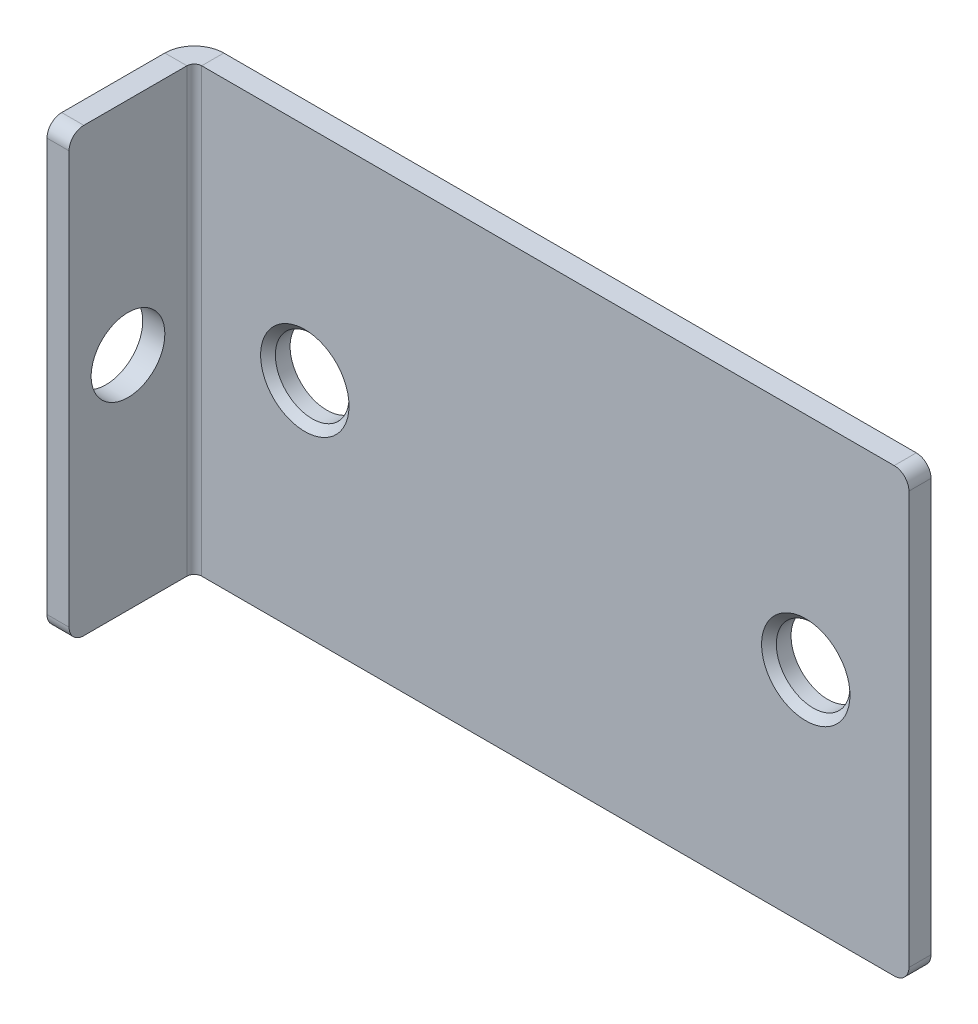
ISO-10303-21;
HEADER;
FILE_DESCRIPTION(('STEP AP214'),'2;1');
FILE_NAME('part.step','',(''),(''),'','','');
FILE_SCHEMA(('AUTOMOTIVE_DESIGN { 1 0 10303 214 1 1 1 1 }'));
ENDSEC;
DATA;
#1=APPLICATION_CONTEXT('core data for automotive mechanical design processes');
#2=APPLICATION_PROTOCOL_DEFINITION('international standard','automotive_design',2000,#1);
#3=PRODUCT_CONTEXT('',#1,'mechanical');
#4=PRODUCT('Part','Part','',(#3));
#5=PRODUCT_RELATED_PRODUCT_CATEGORY('part','',(#4));
#6=PRODUCT_DEFINITION_FORMATION('','',#4);
#7=PRODUCT_DEFINITION_CONTEXT('part definition',#1,'design');
#8=PRODUCT_DEFINITION('design','',#6,#7);
#9=PRODUCT_DEFINITION_SHAPE('','',#8);
#10=(LENGTH_UNIT() NAMED_UNIT(*) SI_UNIT(.MILLI.,.METRE.));
#11=(NAMED_UNIT(*) PLANE_ANGLE_UNIT() SI_UNIT($,.RADIAN.));
#12=(NAMED_UNIT(*) SI_UNIT($,.STERADIAN.) SOLID_ANGLE_UNIT());
#13=UNCERTAINTY_MEASURE_WITH_UNIT(LENGTH_MEASURE(1.E-05),#10,'distance_accuracy_value','');
#14=(GEOMETRIC_REPRESENTATION_CONTEXT(3) GLOBAL_UNCERTAINTY_ASSIGNED_CONTEXT((#13)) GLOBAL_UNIT_ASSIGNED_CONTEXT((#10,
#11,#12)) REPRESENTATION_CONTEXT('',''));
#15=CARTESIAN_POINT('',(0.,0.,0.));
#16=DIRECTION('',(0.,0.,1.));
#17=DIRECTION('',(1.,0.,0.));
#18=AXIS2_PLACEMENT_3D('',#15,#16,#17);
#19=CARTESIAN_POINT('',(0.,0.593023255813957,-0.15));
#20=DIRECTION('',(0.,-1.,0.));
#21=DIRECTION('',(1.,0.,0.));
#22=AXIS2_PLACEMENT_3D('',#19,#20,#21);
#23=PLANE('',#22);
#24=DIRECTION('',(1.,0.,0.));
#25=VECTOR('',#24,1.);
#26=CARTESIAN_POINT('',(0.,0.593023255813957,-0.15));
#27=LINE('',#26,#25);
#28=CARTESIAN_POINT('',(0.199999999999999,0.593023255813957,-0.15));
#29=VERTEX_POINT('',#28);
#30=CARTESIAN_POINT('',(4.9,0.59302325581396,-0.15));
#31=VERTEX_POINT('',#30);
#32=EDGE_CURVE('E227',#29,#31,#27,.T.);
#33=ORIENTED_EDGE('',*,*,#32,.T.);
#34=DIRECTION('',(0.,0.,1.));
#35=VECTOR('',#34,1.);
#36=CARTESIAN_POINT('',(4.9,0.59302325581396,-0.15));
#37=LINE('',#36,#35);
#38=CARTESIAN_POINT('',(4.9,0.59302325581396,0.));
#39=VERTEX_POINT('',#38);
#40=EDGE_CURVE('E13',#31,#39,#37,.T.);
#41=ORIENTED_EDGE('',*,*,#40,.T.);
#42=DIRECTION('',(1.,0.,0.));
#43=VECTOR('',#42,1.);
#44=CARTESIAN_POINT('',(0.,0.593023255813957,0.));
#45=LINE('',#44,#43);
#46=CARTESIAN_POINT('',(0.199999999999999,0.593023255813957,0.));
#47=VERTEX_POINT('',#46);
#48=EDGE_CURVE('E224',#47,#39,#45,.T.);
#49=ORIENTED_EDGE('',*,*,#48,.F.);
#50=DIRECTION('',(0.,0.,-1.));
#51=VECTOR('',#50,1.);
#52=CARTESIAN_POINT('',(0.2,0.593023255813957,0.));
#53=LINE('',#52,#51);
#54=EDGE_CURVE('E213',#47,#29,#53,.T.);
#55=ORIENTED_EDGE('',*,*,#54,.T.);
#56=EDGE_LOOP('',(#33,#41,#49,#55));
#57=FACE_BOUND('',#56,.T.);
#58=ADVANCED_FACE('F65',(#57),#23,.T.);
#59=CARTESIAN_POINT('',(0.,0.,-0.15));
#60=DIRECTION('',(0.,0.,1.));
#61=DIRECTION('',(1.,0.,0.));
#62=AXIS2_PLACEMENT_3D('',#59,#60,#61);
#63=PLANE('',#62);
#64=CARTESIAN_POINT('',(0.899999999999998,2.09302325581396,-0.15));
#65=DIRECTION('',(0.,0.,1.));
#66=DIRECTION('',(1.,0.,0.));
#67=AXIS2_PLACEMENT_3D('',#64,#65,#66);
#68=CIRCLE('',#67,0.25);
#69=CARTESIAN_POINT('',(1.15,2.09302325581396,-0.15));
#70=VERTEX_POINT('',#69);
#71=EDGE_CURVE('E372',#70,#70,#68,.T.);
#72=ORIENTED_EDGE('',*,*,#71,.T.);
#73=EDGE_LOOP('',(#72));
#74=FACE_BOUND('',#73,.T.);
#75=CARTESIAN_POINT('',(4.3,2.09302325581396,-0.15));
#76=DIRECTION('',(0.,0.,1.));
#77=DIRECTION('',(1.,0.,0.));
#78=AXIS2_PLACEMENT_3D('',#75,#76,#77);
#79=CIRCLE('',#78,0.25);
#80=CARTESIAN_POINT('',(4.55,2.09302325581396,-0.15));
#81=VERTEX_POINT('',#80);
#82=EDGE_CURVE('E388',#81,#81,#79,.T.);
#83=ORIENTED_EDGE('',*,*,#82,.T.);
#84=EDGE_LOOP('',(#83));
#85=FACE_BOUND('',#84,.T.);
#86=DIRECTION('',(-1.,0.,0.));
#87=VECTOR('',#86,1.);
#88=CARTESIAN_POINT('',(0.,3.59302325581396,-0.15));
#89=LINE('',#88,#87);
#90=CARTESIAN_POINT('',(4.9,3.59302325581396,-0.15));
#91=VERTEX_POINT('',#90);
#92=CARTESIAN_POINT('',(0.199999999999998,3.59302325581396,-0.15));
#93=VERTEX_POINT('',#92);
#94=EDGE_CURVE('E233',#91,#93,#89,.T.);
#95=ORIENTED_EDGE('',*,*,#94,.F.);
#96=CARTESIAN_POINT('',(4.9,3.49302325581396,-0.15));
#97=DIRECTION('',(0.,0.,1.));
#98=DIRECTION('',(1.,0.,0.));
#99=AXIS2_PLACEMENT_3D('',#96,#97,#98);
#100=CIRCLE('',#99,0.1);
#101=CARTESIAN_POINT('',(5.,3.49302325581396,-0.15));
#102=VERTEX_POINT('',#101);
#103=EDGE_CURVE('E73',#91,#102,#100,.F.);
#104=ORIENTED_EDGE('',*,*,#103,.T.);
#105=DIRECTION('',(0.,1.,0.));
#106=VECTOR('',#105,1.);
#107=CARTESIAN_POINT('',(5.,3.59302325581396,-0.15));
#108=LINE('',#107,#106);
#109=CARTESIAN_POINT('',(5.,0.69302325581396,-0.15));
#110=VERTEX_POINT('',#109);
#111=EDGE_CURVE('E229',#110,#102,#108,.T.);
#112=ORIENTED_EDGE('',*,*,#111,.F.);
#113=CARTESIAN_POINT('',(4.9,0.693023255813961,-0.15));
#114=DIRECTION('',(0.,0.,1.));
#115=DIRECTION('',(1.,0.,0.));
#116=AXIS2_PLACEMENT_3D('',#113,#114,#115);
#117=CIRCLE('',#116,0.1);
#118=EDGE_CURVE('E80',#110,#31,#117,.F.);
#119=ORIENTED_EDGE('',*,*,#118,.T.);
#120=ORIENTED_EDGE('',*,*,#32,.F.);
#121=DIRECTION('',(0.,-1.,0.));
#122=VECTOR('',#121,1.);
#123=CARTESIAN_POINT('',(0.199999999999999,0.593023255813957,-0.15));
#124=LINE('',#123,#122);
#125=EDGE_CURVE('E165',#29,#93,#124,.F.);
#126=ORIENTED_EDGE('',*,*,#125,.T.);
#127=EDGE_LOOP('',(#95,#104,#112,#119,#120,#126));
#128=FACE_BOUND('',#127,.T.);
#129=ADVANCED_FACE('F269',(#74,#85,#128),#63,.F.);
#130=CARTESIAN_POINT('',(0.,0.,0.));
#131=DIRECTION('',(0.,0.,1.));
#132=DIRECTION('',(1.,0.,0.));
#133=AXIS2_PLACEMENT_3D('',#130,#131,#132);
#134=PLANE('',#133);
#135=CARTESIAN_POINT('',(0.899999999999998,2.09302325581396,0.));
#136=DIRECTION('',(0.,0.,1.));
#137=DIRECTION('',(1.,0.,0.));
#138=AXIS2_PLACEMENT_3D('',#135,#136,#137);
#139=CIRCLE('',#138,0.3);
#140=CARTESIAN_POINT('',(1.2,2.09302325581396,0.));
#141=VERTEX_POINT('',#140);
#142=EDGE_CURVE('E376',#141,#141,#139,.T.);
#143=ORIENTED_EDGE('',*,*,#142,.F.);
#144=EDGE_LOOP('',(#143));
#145=FACE_BOUND('',#144,.T.);
#146=CARTESIAN_POINT('',(4.3,2.09302325581396,0.));
#147=DIRECTION('',(0.,0.,1.));
#148=DIRECTION('',(1.,0.,0.));
#149=AXIS2_PLACEMENT_3D('',#146,#147,#148);
#150=CIRCLE('',#149,0.3);
#151=CARTESIAN_POINT('',(4.6,2.09302325581396,0.));
#152=VERTEX_POINT('',#151);
#153=EDGE_CURVE('E378',#152,#152,#150,.T.);
#154=ORIENTED_EDGE('',*,*,#153,.F.);
#155=EDGE_LOOP('',(#154));
#156=FACE_BOUND('',#155,.T.);
#157=DIRECTION('',(0.,1.,0.));
#158=VECTOR('',#157,1.);
#159=CARTESIAN_POINT('',(5.,3.59302325581396,0.));
#160=LINE('',#159,#158);
#161=CARTESIAN_POINT('',(5.,0.69302325581396,0.));
#162=VERTEX_POINT('',#161);
#163=CARTESIAN_POINT('',(5.,3.49302325581396,0.));
#164=VERTEX_POINT('',#163);
#165=EDGE_CURVE('E238',#162,#164,#160,.T.);
#166=ORIENTED_EDGE('',*,*,#165,.T.);
#167=CARTESIAN_POINT('',(4.9,3.49302325581396,0.));
#168=DIRECTION('',(0.,0.,1.));
#169=DIRECTION('',(1.,0.,0.));
#170=AXIS2_PLACEMENT_3D('',#167,#168,#169);
#171=CIRCLE('',#170,0.1);
#172=CARTESIAN_POINT('',(4.9,3.59302325581396,0.));
#173=VERTEX_POINT('',#172);
#174=EDGE_CURVE('E265',#164,#173,#171,.T.);
#175=ORIENTED_EDGE('',*,*,#174,.T.);
#176=DIRECTION('',(-1.,0.,0.));
#177=VECTOR('',#176,1.);
#178=CARTESIAN_POINT('',(0.,3.59302325581396,0.));
#179=LINE('',#178,#177);
#180=CARTESIAN_POINT('',(0.199999999999998,3.59302325581396,0.));
#181=VERTEX_POINT('',#180);
#182=EDGE_CURVE('E230',#173,#181,#179,.T.);
#183=ORIENTED_EDGE('',*,*,#182,.T.);
#184=DIRECTION('',(0.,-1.,0.));
#185=VECTOR('',#184,1.);
#186=CARTESIAN_POINT('',(0.2,0.593023255813957,0.));
#187=LINE('',#186,#185);
#188=EDGE_CURVE('E217',#47,#181,#187,.F.);
#189=ORIENTED_EDGE('',*,*,#188,.F.);
#190=ORIENTED_EDGE('',*,*,#48,.T.);
#191=CARTESIAN_POINT('',(4.9,0.693023255813961,0.));
#192=DIRECTION('',(0.,0.,1.));
#193=DIRECTION('',(1.,0.,0.));
#194=AXIS2_PLACEMENT_3D('',#191,#192,#193);
#195=CIRCLE('',#194,0.1);
#196=EDGE_CURVE('E263',#39,#162,#195,.T.);
#197=ORIENTED_EDGE('',*,*,#196,.T.);
#198=EDGE_LOOP('',(#166,#175,#183,#189,#190,#197));
#199=FACE_BOUND('',#198,.T.);
#200=ADVANCED_FACE('F278',(#145,#156,#199),#134,.T.);
#201=CARTESIAN_POINT('',(0.,3.59302325581396,-0.15));
#202=DIRECTION('',(0.,1.,0.));
#203=DIRECTION('',(-1.,0.,0.));
#204=AXIS2_PLACEMENT_3D('',#201,#202,#203);
#205=PLANE('',#204);
#206=ORIENTED_EDGE('',*,*,#182,.F.);
#207=DIRECTION('',(0.,0.,1.));
#208=VECTOR('',#207,1.);
#209=CARTESIAN_POINT('',(4.9,3.59302325581396,-0.15));
#210=LINE('',#209,#208);
#211=EDGE_CURVE('E88',#173,#91,#210,.F.);
#212=ORIENTED_EDGE('',*,*,#211,.T.);
#213=ORIENTED_EDGE('',*,*,#94,.T.);
#214=DIRECTION('',(0.,0.,-1.));
#215=VECTOR('',#214,1.);
#216=CARTESIAN_POINT('',(0.199999999999998,3.59302325581396,0.));
#217=LINE('',#216,#215);
#218=EDGE_CURVE('E221',#181,#93,#217,.T.);
#219=ORIENTED_EDGE('',*,*,#218,.F.);
#220=EDGE_LOOP('',(#206,#212,#213,#219));
#221=FACE_BOUND('',#220,.T.);
#222=ADVANCED_FACE('F280',(#221),#205,.T.);
#223=CARTESIAN_POINT('',(5.,3.59302325581396,-0.15));
#224=DIRECTION('',(1.,0.,0.));
#225=DIRECTION('',(0.,1.,0.));
#226=AXIS2_PLACEMENT_3D('',#223,#224,#225);
#227=PLANE('',#226);
#228=ORIENTED_EDGE('',*,*,#111,.T.);
#229=DIRECTION('',(0.,0.,1.));
#230=VECTOR('',#229,1.);
#231=CARTESIAN_POINT('',(5.,3.49302325581396,-0.15));
#232=LINE('',#231,#230);
#233=EDGE_CURVE('E260',#102,#164,#232,.T.);
#234=ORIENTED_EDGE('',*,*,#233,.T.);
#235=ORIENTED_EDGE('',*,*,#165,.F.);
#236=DIRECTION('',(0.,0.,1.));
#237=VECTOR('',#236,1.);
#238=CARTESIAN_POINT('',(5.,0.69302325581396,-0.15));
#239=LINE('',#238,#237);
#240=EDGE_CURVE('E258',#162,#110,#239,.F.);
#241=ORIENTED_EDGE('',*,*,#240,.T.);
#242=EDGE_LOOP('',(#228,#234,#235,#241));
#243=FACE_BOUND('',#242,.T.);
#244=ADVANCED_FACE('F273',(#243),#227,.T.);
#245=CARTESIAN_POINT('',(0.199999999999998,3.59302325581396,0.05));
#246=DIRECTION('',(0.,1.,0.));
#247=DIRECTION('',(-1.,0.,0.));
#248=AXIS2_PLACEMENT_3D('',#245,#246,#247);
#249=PLANE('',#248);
#250=DIRECTION('',(1.,0.,0.));
#251=VECTOR('',#250,1.);
#252=CARTESIAN_POINT('',(0.,3.59302325581396,0.0499999999999993));
#253=LINE('',#252,#251);
#254=CARTESIAN_POINT('',(0.149999999999999,3.59302325581396,0.0499999999999998));
#255=VERTEX_POINT('',#254);
#256=CARTESIAN_POINT('',(0.,3.59302325581396,0.0499999999999993));
#257=VERTEX_POINT('',#256);
#258=EDGE_CURVE('E207',#255,#257,#253,.F.);
#259=ORIENTED_EDGE('',*,*,#258,.F.);
#260=CARTESIAN_POINT('',(0.199999999999998,3.59302325581396,0.05));
#261=DIRECTION('',(0.,-1.,0.));
#262=DIRECTION('',(1.,0.,0.));
#263=AXIS2_PLACEMENT_3D('',#260,#261,#262);
#264=CIRCLE('',#263,0.0499999999999996);
#265=EDGE_CURVE('E168',#181,#255,#264,.F.);
#266=ORIENTED_EDGE('',*,*,#265,.F.);
#267=ORIENTED_EDGE('',*,*,#218,.T.);
#268=CARTESIAN_POINT('',(0.199999999999998,3.59302325581396,0.05));
#269=DIRECTION('',(0.,-1.,0.));
#270=DIRECTION('',(1.,0.,0.));
#271=AXIS2_PLACEMENT_3D('',#268,#269,#270);
#272=CIRCLE('',#271,0.2);
#273=EDGE_CURVE('E212',#93,#257,#272,.F.);
#274=ORIENTED_EDGE('',*,*,#273,.T.);
#275=EDGE_LOOP('',(#259,#266,#267,#274));
#276=FACE_BOUND('',#275,.T.);
#277=ADVANCED_FACE('F288',(#276),#249,.T.);
#278=CARTESIAN_POINT('',(0.2,0.593023255813957,0.05));
#279=DIRECTION('',(0.,1.,0.));
#280=DIRECTION('',(-1.,0.,0.));
#281=AXIS2_PLACEMENT_3D('',#278,#279,#280);
#282=PLANE('',#281);
#283=CARTESIAN_POINT('',(0.2,0.593023255813957,0.05));
#284=DIRECTION('',(0.,-1.,0.));
#285=DIRECTION('',(1.,0.,0.));
#286=AXIS2_PLACEMENT_3D('',#283,#284,#285);
#287=CIRCLE('',#286,0.0499999999999996);
#288=CARTESIAN_POINT('',(0.15,0.593023255813957,0.0499999999999998));
#289=VERTEX_POINT('',#288);
#290=EDGE_CURVE('E175',#289,#47,#287,.T.);
#291=ORIENTED_EDGE('',*,*,#290,.F.);
#292=DIRECTION('',(1.,0.,0.));
#293=VECTOR('',#292,1.);
#294=CARTESIAN_POINT('',(0.15,0.593023255813957,0.0499999999999998));
#295=LINE('',#294,#293);
#296=CARTESIAN_POINT('',(0.,0.593023255813957,0.0499999999999993));
#297=VERTEX_POINT('',#296);
#298=EDGE_CURVE('E172',#289,#297,#295,.F.);
#299=ORIENTED_EDGE('',*,*,#298,.T.);
#300=CARTESIAN_POINT('',(0.2,0.593023255813957,0.05));
#301=DIRECTION('',(0.,-1.,0.));
#302=DIRECTION('',(1.,0.,0.));
#303=AXIS2_PLACEMENT_3D('',#300,#301,#302);
#304=CIRCLE('',#303,0.2);
#305=EDGE_CURVE('E157',#297,#29,#304,.T.);
#306=ORIENTED_EDGE('',*,*,#305,.T.);
#307=ORIENTED_EDGE('',*,*,#54,.F.);
#308=EDGE_LOOP('',(#291,#299,#306,#307));
#309=FACE_BOUND('',#308,.T.);
#310=ADVANCED_FACE('F173',(#309),#282,.F.);
#311=CARTESIAN_POINT('',(0.2,0.593023255813957,0.05));
#312=DIRECTION('',(0.,-1.,0.));
#313=DIRECTION('',(-1.,0.,0.));
#314=AXIS2_PLACEMENT_3D('',#311,#312,#313);
#315=CYLINDRICAL_SURFACE('',#314,0.2);
#316=ORIENTED_EDGE('',*,*,#125,.F.);
#317=ORIENTED_EDGE('',*,*,#305,.F.);
#318=DIRECTION('',(0.,-1.,0.));
#319=VECTOR('',#318,1.);
#320=CARTESIAN_POINT('',(0.,3.59302325581396,0.0499999999999993));
#321=LINE('',#320,#319);
#322=EDGE_CURVE('E162',#297,#257,#321,.F.);
#323=ORIENTED_EDGE('',*,*,#322,.T.);
#324=ORIENTED_EDGE('',*,*,#273,.F.);
#325=EDGE_LOOP('',(#316,#317,#323,#324));
#326=FACE_BOUND('',#325,.T.);
#327=ADVANCED_FACE('F159',(#326),#315,.T.);
#328=CARTESIAN_POINT('',(0.2,0.593023255813957,0.05));
#329=DIRECTION('',(0.,-1.,0.));
#330=DIRECTION('',(-1.,0.,0.));
#331=AXIS2_PLACEMENT_3D('',#328,#329,#330);
#332=CYLINDRICAL_SURFACE('',#331,0.0499999999999996);
#333=ORIENTED_EDGE('',*,*,#188,.T.);
#334=ORIENTED_EDGE('',*,*,#265,.T.);
#335=DIRECTION('',(0.,-1.,0.));
#336=VECTOR('',#335,1.);
#337=CARTESIAN_POINT('',(0.149999999999999,3.59302325581396,0.0499999999999998));
#338=LINE('',#337,#336);
#339=EDGE_CURVE('E180',#255,#289,#338,.T.);
#340=ORIENTED_EDGE('',*,*,#339,.T.);
#341=ORIENTED_EDGE('',*,*,#290,.T.);
#342=EDGE_LOOP('',(#333,#334,#340,#341));
#343=FACE_BOUND('',#342,.T.);
#344=ADVANCED_FACE('F284',(#343),#332,.F.);
#345=CARTESIAN_POINT('',(0.,0.593023255813957,0.85));
#346=DIRECTION('',(0.,1.,0.));
#347=DIRECTION('',(-1.,0.,0.));
#348=AXIS2_PLACEMENT_3D('',#345,#346,#347);
#349=PLANE('',#348);
#350=DIRECTION('',(0.,0.,-1.));
#351=VECTOR('',#350,1.);
#352=CARTESIAN_POINT('',(0.149999999999997,0.593023255813957,0.850000000000001));
#353=LINE('',#352,#351);
#354=CARTESIAN_POINT('',(0.149999999999997,0.593023255813957,0.750000000000001));
#355=VERTEX_POINT('',#354);
#356=EDGE_CURVE('E190',#289,#355,#353,.F.);
#357=ORIENTED_EDGE('',*,*,#356,.T.);
#358=DIRECTION('',(1.,0.,0.));
#359=VECTOR('',#358,1.);
#360=CARTESIAN_POINT('',(0.,0.593023255813957,0.75));
#361=LINE('',#360,#359);
#362=CARTESIAN_POINT('',(0.,0.593023255813957,0.75));
#363=VERTEX_POINT('',#362);
#364=EDGE_CURVE('E194',#355,#363,#361,.F.);
#365=ORIENTED_EDGE('',*,*,#364,.T.);
#366=DIRECTION('',(0.,0.,1.));
#367=VECTOR('',#366,1.);
#368=CARTESIAN_POINT('',(0.,0.593023255813957,0.));
#369=LINE('',#368,#367);
#370=EDGE_CURVE('E186',#297,#363,#369,.T.);
#371=ORIENTED_EDGE('',*,*,#370,.F.);
#372=ORIENTED_EDGE('',*,*,#298,.F.);
#373=EDGE_LOOP('',(#357,#365,#371,#372));
#374=FACE_BOUND('',#373,.T.);
#375=ADVANCED_FACE('F192',(#374),#349,.F.);
#376=CARTESIAN_POINT('',(0.,3.59302325581396,0.));
#377=DIRECTION('',(0.,-1.,0.));
#378=DIRECTION('',(1.,0.,0.));
#379=AXIS2_PLACEMENT_3D('',#376,#377,#378);
#380=PLANE('',#379);
#381=DIRECTION('',(0.,0.,-1.));
#382=VECTOR('',#381,1.);
#383=CARTESIAN_POINT('',(0.,3.59302325581396,0.));
#384=LINE('',#383,#382);
#385=CARTESIAN_POINT('',(0.,3.59302325581396,0.75));
#386=VERTEX_POINT('',#385);
#387=EDGE_CURVE('E189',#386,#257,#384,.T.);
#388=ORIENTED_EDGE('',*,*,#387,.F.);
#389=DIRECTION('',(1.,0.,0.));
#390=VECTOR('',#389,1.);
#391=CARTESIAN_POINT('',(0.,3.59302325581396,0.75));
#392=LINE('',#391,#390);
#393=CARTESIAN_POINT('',(0.149999999999996,3.59302325581396,0.750000000000001));
#394=VERTEX_POINT('',#393);
#395=EDGE_CURVE('E235',#386,#394,#392,.T.);
#396=ORIENTED_EDGE('',*,*,#395,.T.);
#397=DIRECTION('',(0.,0.,1.));
#398=VECTOR('',#397,1.);
#399=CARTESIAN_POINT('',(0.149999999999999,3.59302325581396,0.));
#400=LINE('',#399,#398);
#401=EDGE_CURVE('E196',#394,#255,#400,.F.);
#402=ORIENTED_EDGE('',*,*,#401,.T.);
#403=ORIENTED_EDGE('',*,*,#258,.T.);
#404=EDGE_LOOP('',(#388,#396,#402,#403));
#405=FACE_BOUND('',#404,.T.);
#406=ADVANCED_FACE('F290',(#405),#380,.F.);
#407=CARTESIAN_POINT('',(0.,0.,0.));
#408=DIRECTION('',(1.,0.,0.));
#409=DIRECTION('',(0.,0.,-1.));
#410=AXIS2_PLACEMENT_3D('',#407,#408,#409);
#411=PLANE('',#410);
#412=CARTESIAN_POINT('',(0.,2.09302325581396,0.45));
#413=DIRECTION('',(1.,0.,0.));
#414=DIRECTION('',(0.,0.,-1.));
#415=AXIS2_PLACEMENT_3D('',#412,#413,#414);
#416=CIRCLE('',#415,0.25);
#417=CARTESIAN_POINT('',(0.,2.09302325581396,0.2));
#418=VERTEX_POINT('',#417);
#419=EDGE_CURVE('E210',#418,#418,#416,.T.);
#420=ORIENTED_EDGE('',*,*,#419,.T.);
#421=EDGE_LOOP('',(#420));
#422=FACE_BOUND('',#421,.T.);
#423=DIRECTION('',(0.,1.,0.));
#424=VECTOR('',#423,1.);
#425=CARTESIAN_POINT('',(0.,0.,0.85));
#426=LINE('',#425,#424);
#427=CARTESIAN_POINT('',(0.,0.693023255813957,0.85));
#428=VERTEX_POINT('',#427);
#429=CARTESIAN_POINT('',(0.,3.49302325581396,0.85));
#430=VERTEX_POINT('',#429);
#431=EDGE_CURVE('E195',#428,#430,#426,.T.);
#432=ORIENTED_EDGE('',*,*,#431,.T.);
#433=CARTESIAN_POINT('',(0.,3.49302325581396,0.75));
#434=DIRECTION('',(1.,0.,0.));
#435=DIRECTION('',(0.,0.,-1.));
#436=AXIS2_PLACEMENT_3D('',#433,#434,#435);
#437=CIRCLE('',#436,0.1);
#438=EDGE_CURVE('E255',#430,#386,#437,.F.);
#439=ORIENTED_EDGE('',*,*,#438,.T.);
#440=ORIENTED_EDGE('',*,*,#387,.T.);
#441=ORIENTED_EDGE('',*,*,#322,.F.);
#442=ORIENTED_EDGE('',*,*,#370,.T.);
#443=CARTESIAN_POINT('',(0.,0.693023255813957,0.75));
#444=DIRECTION('',(1.,0.,0.));
#445=DIRECTION('',(0.,0.,-1.));
#446=AXIS2_PLACEMENT_3D('',#443,#444,#445);
#447=CIRCLE('',#446,0.1);
#448=EDGE_CURVE('E253',#363,#428,#447,.F.);
#449=ORIENTED_EDGE('',*,*,#448,.T.);
#450=EDGE_LOOP('',(#432,#439,#440,#441,#442,#449));
#451=FACE_BOUND('',#450,.T.);
#452=ADVANCED_FACE('F185',(#422,#451),#411,.F.);
#453=CARTESIAN_POINT('',(0.15,0.,0.));
#454=DIRECTION('',(1.,0.,0.));
#455=DIRECTION('',(0.,0.,-1.));
#456=AXIS2_PLACEMENT_3D('',#453,#454,#455);
#457=PLANE('',#456);
#458=CARTESIAN_POINT('',(0.149999999999998,2.09302325581396,0.45));
#459=DIRECTION('',(1.,0.,0.));
#460=DIRECTION('',(0.,0.,-1.));
#461=AXIS2_PLACEMENT_3D('',#458,#459,#460);
#462=CIRCLE('',#461,0.25);
#463=CARTESIAN_POINT('',(0.149999999999999,2.09302325581396,0.2));
#464=VERTEX_POINT('',#463);
#465=EDGE_CURVE('E391',#464,#464,#462,.T.);
#466=ORIENTED_EDGE('',*,*,#465,.F.);
#467=EDGE_LOOP('',(#466));
#468=FACE_BOUND('',#467,.T.);
#469=ORIENTED_EDGE('',*,*,#401,.F.);
#470=CARTESIAN_POINT('',(0.149999999999996,3.49302325581396,0.750000000000001));
#471=DIRECTION('',(1.,0.,0.));
#472=DIRECTION('',(0.,0.,-1.));
#473=AXIS2_PLACEMENT_3D('',#470,#471,#472);
#474=CIRCLE('',#473,0.1);
#475=CARTESIAN_POINT('',(0.149999999999996,3.49302325581396,0.850000000000001));
#476=VERTEX_POINT('',#475);
#477=EDGE_CURVE('E246',#394,#476,#474,.T.);
#478=ORIENTED_EDGE('',*,*,#477,.T.);
#479=DIRECTION('',(0.,-1.,0.));
#480=VECTOR('',#479,1.);
#481=CARTESIAN_POINT('',(0.149999999999996,3.59302325581396,0.850000000000001));
#482=LINE('',#481,#480);
#483=CARTESIAN_POINT('',(0.149999999999997,0.693023255813957,0.850000000000001));
#484=VERTEX_POINT('',#483);
#485=EDGE_CURVE('E199',#484,#476,#482,.F.);
#486=ORIENTED_EDGE('',*,*,#485,.F.);
#487=CARTESIAN_POINT('',(0.149999999999997,0.693023255813957,0.750000000000001));
#488=DIRECTION('',(1.,0.,0.));
#489=DIRECTION('',(0.,0.,-1.));
#490=AXIS2_PLACEMENT_3D('',#487,#488,#489);
#491=CIRCLE('',#490,0.1);
#492=EDGE_CURVE('E244',#484,#355,#491,.T.);
#493=ORIENTED_EDGE('',*,*,#492,.T.);
#494=ORIENTED_EDGE('',*,*,#356,.F.);
#495=ORIENTED_EDGE('',*,*,#339,.F.);
#496=EDGE_LOOP('',(#469,#478,#486,#493,#494,#495));
#497=FACE_BOUND('',#496,.T.);
#498=ADVANCED_FACE('F294',(#468,#497),#457,.T.);
#499=CARTESIAN_POINT('',(0.,3.59302325581396,0.85));
#500=DIRECTION('',(0.,0.,-1.));
#501=DIRECTION('',(-1.,0.,0.));
#502=AXIS2_PLACEMENT_3D('',#499,#500,#501);
#503=PLANE('',#502);
#504=ORIENTED_EDGE('',*,*,#485,.T.);
#505=DIRECTION('',(1.,0.,0.));
#506=VECTOR('',#505,1.);
#507=CARTESIAN_POINT('',(0.,3.49302325581396,0.85));
#508=LINE('',#507,#506);
#509=EDGE_CURVE('E251',#476,#430,#508,.F.);
#510=ORIENTED_EDGE('',*,*,#509,.T.);
#511=ORIENTED_EDGE('',*,*,#431,.F.);
#512=DIRECTION('',(1.,0.,0.));
#513=VECTOR('',#512,1.);
#514=CARTESIAN_POINT('',(0.,0.693023255813957,0.85));
#515=LINE('',#514,#513);
#516=EDGE_CURVE('E248',#428,#484,#515,.T.);
#517=ORIENTED_EDGE('',*,*,#516,.T.);
#518=EDGE_LOOP('',(#504,#510,#511,#517));
#519=FACE_BOUND('',#518,.T.);
#520=ADVANCED_FACE('F302',(#519),#503,.F.);
#521=CARTESIAN_POINT('',(0.,2.09302325581396,0.45));
#522=DIRECTION('',(1.,0.,0.));
#523=DIRECTION('',(0.,0.,-1.));
#524=AXIS2_PLACEMENT_3D('',#521,#522,#523);
#525=CYLINDRICAL_SURFACE('',#524,0.25);
#526=ORIENTED_EDGE('',*,*,#419,.F.);
#527=EDGE_LOOP('',(#526));
#528=FACE_BOUND('',#527,.T.);
#529=ORIENTED_EDGE('',*,*,#465,.T.);
#530=EDGE_LOOP('',(#529));
#531=FACE_BOUND('',#530,.T.);
#532=ADVANCED_FACE('F345',(#528,#531),#525,.F.);
#533=CARTESIAN_POINT('',(4.3,2.09302325581396,0.));
#534=DIRECTION('',(0.,0.,1.));
#535=DIRECTION('',(1.,0.,0.));
#536=AXIS2_PLACEMENT_3D('',#533,#534,#535);
#537=CYLINDRICAL_SURFACE('',#536,0.25);
#538=ORIENTED_EDGE('',*,*,#82,.F.);
#539=EDGE_LOOP('',(#538));
#540=FACE_BOUND('',#539,.T.);
#541=CARTESIAN_POINT('',(4.3,2.09302325581396,-0.0499999999999999));
#542=DIRECTION('',(0.,0.,1.));
#543=DIRECTION('',(1.,0.,0.));
#544=AXIS2_PLACEMENT_3D('',#541,#542,#543);
#545=CIRCLE('',#544,0.25);
#546=CARTESIAN_POINT('',(4.55,2.09302325581396,-0.0499999999999999));
#547=VERTEX_POINT('',#546);
#548=EDGE_CURVE('E385',#547,#547,#545,.T.);
#549=ORIENTED_EDGE('',*,*,#548,.T.);
#550=EDGE_LOOP('',(#549));
#551=FACE_BOUND('',#550,.T.);
#552=ADVANCED_FACE('F356',(#540,#551),#537,.F.);
#553=CARTESIAN_POINT('',(4.3,2.09302325581396,0.));
#554=DIRECTION('',(0.,0.,1.));
#555=DIRECTION('',(1.,0.,0.));
#556=AXIS2_PLACEMENT_3D('',#553,#554,#555);
#557=CONICAL_SURFACE('',#556,0.3,0.785398163397429);
#558=ORIENTED_EDGE('',*,*,#548,.F.);
#559=EDGE_LOOP('',(#558));
#560=FACE_BOUND('',#559,.T.);
#561=ORIENTED_EDGE('',*,*,#153,.T.);
#562=EDGE_LOOP('',(#561));
#563=FACE_BOUND('',#562,.T.);
#564=ADVANCED_FACE('F360',(#560,#563),#557,.F.);
#565=CARTESIAN_POINT('',(0.899999999999998,2.09302325581396,0.));
#566=DIRECTION('',(0.,0.,1.));
#567=DIRECTION('',(1.,0.,0.));
#568=AXIS2_PLACEMENT_3D('',#565,#566,#567);
#569=CYLINDRICAL_SURFACE('',#568,0.25);
#570=ORIENTED_EDGE('',*,*,#71,.F.);
#571=EDGE_LOOP('',(#570));
#572=FACE_BOUND('',#571,.T.);
#573=CARTESIAN_POINT('',(0.899999999999998,2.09302325581396,-0.0499999999999999));
#574=DIRECTION('',(0.,0.,1.));
#575=DIRECTION('',(1.,0.,0.));
#576=AXIS2_PLACEMENT_3D('',#573,#574,#575);
#577=CIRCLE('',#576,0.25);
#578=CARTESIAN_POINT('',(1.15,2.09302325581396,-0.0499999999999999));
#579=VERTEX_POINT('',#578);
#580=EDGE_CURVE('E375',#579,#579,#577,.T.);
#581=ORIENTED_EDGE('',*,*,#580,.T.);
#582=EDGE_LOOP('',(#581));
#583=FACE_BOUND('',#582,.T.);
#584=ADVANCED_FACE('F315',(#572,#583),#569,.F.);
#585=CARTESIAN_POINT('',(0.899999999999998,2.09302325581396,0.));
#586=DIRECTION('',(0.,0.,1.));
#587=DIRECTION('',(1.,0.,0.));
#588=AXIS2_PLACEMENT_3D('',#585,#586,#587);
#589=CONICAL_SURFACE('',#588,0.3,0.785398163397431);
#590=ORIENTED_EDGE('',*,*,#580,.F.);
#591=EDGE_LOOP('',(#590));
#592=FACE_BOUND('',#591,.T.);
#593=ORIENTED_EDGE('',*,*,#142,.T.);
#594=EDGE_LOOP('',(#593));
#595=FACE_BOUND('',#594,.T.);
#596=ADVANCED_FACE('F307',(#592,#595),#589,.F.);
#597=CARTESIAN_POINT('',(0.,3.49302325581396,0.75));
#598=DIRECTION('',(1.,0.,0.));
#599=DIRECTION('',(0.,0.,-1.));
#600=AXIS2_PLACEMENT_3D('',#597,#598,#599);
#601=CYLINDRICAL_SURFACE('',#600,0.1);
#602=ORIENTED_EDGE('',*,*,#438,.F.);
#603=ORIENTED_EDGE('',*,*,#509,.F.);
#604=ORIENTED_EDGE('',*,*,#477,.F.);
#605=ORIENTED_EDGE('',*,*,#395,.F.);
#606=EDGE_LOOP('',(#602,#603,#604,#605));
#607=FACE_BOUND('',#606,.T.);
#608=ADVANCED_FACE('F305',(#607),#601,.T.);
#609=CARTESIAN_POINT('',(0.,0.693023255813957,0.75));
#610=DIRECTION('',(1.,0.,0.));
#611=DIRECTION('',(0.,0.,-1.));
#612=AXIS2_PLACEMENT_3D('',#609,#610,#611);
#613=CYLINDRICAL_SURFACE('',#612,0.1);
#614=ORIENTED_EDGE('',*,*,#448,.F.);
#615=ORIENTED_EDGE('',*,*,#364,.F.);
#616=ORIENTED_EDGE('',*,*,#492,.F.);
#617=ORIENTED_EDGE('',*,*,#516,.F.);
#618=EDGE_LOOP('',(#614,#615,#616,#617));
#619=FACE_BOUND('',#618,.T.);
#620=ADVANCED_FACE('F297',(#619),#613,.T.);
#621=CARTESIAN_POINT('',(4.9,3.49302325581396,-0.15));
#622=DIRECTION('',(0.,0.,1.));
#623=DIRECTION('',(1.,0.,0.));
#624=AXIS2_PLACEMENT_3D('',#621,#622,#623);
#625=CYLINDRICAL_SURFACE('',#624,0.1);
#626=ORIENTED_EDGE('',*,*,#103,.F.);
#627=ORIENTED_EDGE('',*,*,#211,.F.);
#628=ORIENTED_EDGE('',*,*,#174,.F.);
#629=ORIENTED_EDGE('',*,*,#233,.F.);
#630=EDGE_LOOP('',(#626,#627,#628,#629));
#631=FACE_BOUND('',#630,.T.);
#632=ADVANCED_FACE('F276',(#631),#625,.T.);
#633=CARTESIAN_POINT('',(4.9,0.693023255813961,-0.15));
#634=DIRECTION('',(0.,0.,1.));
#635=DIRECTION('',(1.,0.,0.));
#636=AXIS2_PLACEMENT_3D('',#633,#634,#635);
#637=CYLINDRICAL_SURFACE('',#636,0.1);
#638=ORIENTED_EDGE('',*,*,#118,.F.);
#639=ORIENTED_EDGE('',*,*,#240,.F.);
#640=ORIENTED_EDGE('',*,*,#196,.F.);
#641=ORIENTED_EDGE('',*,*,#40,.F.);
#642=EDGE_LOOP('',(#638,#639,#640,#641));
#643=FACE_BOUND('',#642,.T.);
#644=ADVANCED_FACE('F67',(#643),#637,.T.);
#645=CLOSED_SHELL('',(#58,#129,#200,#222,#244,#277,#310,#327,#344,#375,#406,#452,#498,#520,#532,
#552,#564,#584,#596,#608,#620,#632,#644));
#646=MANIFOLD_SOLID_BREP('B2',#645);
#647=ADVANCED_BREP_SHAPE_REPRESENTATION('',(#18,#646),#14);
#648=SHAPE_DEFINITION_REPRESENTATION(#9,#647);
ENDSEC;
END-ISO-10303-21;
